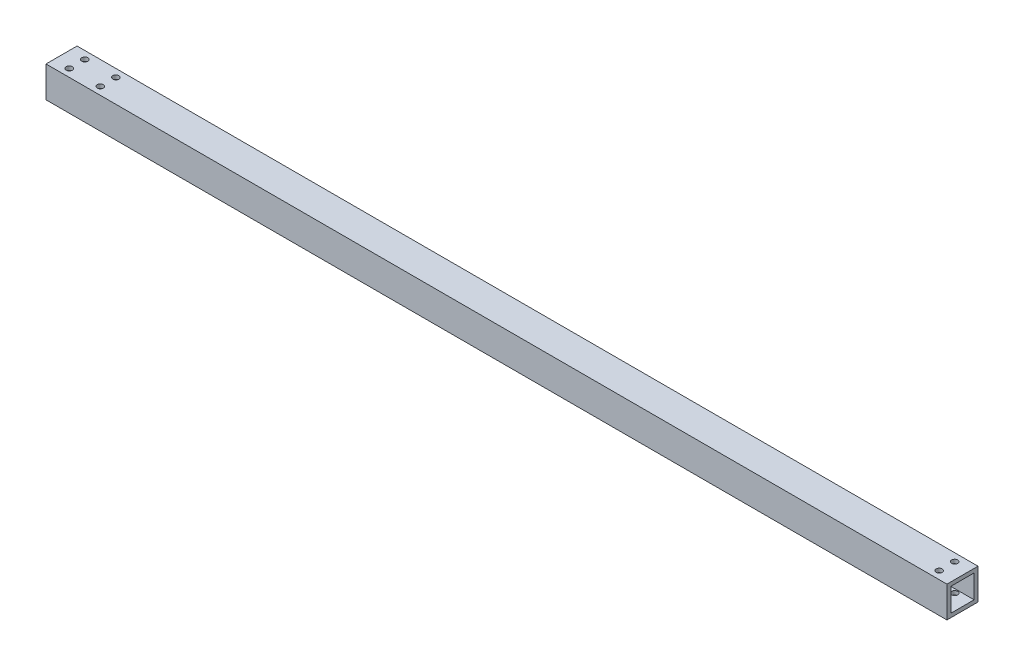
ISO-10303-21;
HEADER;
FILE_DESCRIPTION(('STEP AP214'),'2;1');
FILE_NAME('part.step','',(''),(''),'','','');
FILE_SCHEMA(('AUTOMOTIVE_DESIGN { 1 0 10303 214 1 1 1 1 }'));
ENDSEC;
DATA;
#1=APPLICATION_CONTEXT('core data for automotive mechanical design processes');
#2=APPLICATION_PROTOCOL_DEFINITION('international standard','automotive_design',2000,#1);
#3=PRODUCT_CONTEXT('',#1,'mechanical');
#4=PRODUCT('Part','Part','',(#3));
#5=PRODUCT_RELATED_PRODUCT_CATEGORY('part','',(#4));
#6=PRODUCT_DEFINITION_FORMATION('','',#4);
#7=PRODUCT_DEFINITION_CONTEXT('part definition',#1,'design');
#8=PRODUCT_DEFINITION('design','',#6,#7);
#9=PRODUCT_DEFINITION_SHAPE('','',#8);
#10=(LENGTH_UNIT() NAMED_UNIT(*) SI_UNIT(.MILLI.,.METRE.));
#11=(NAMED_UNIT(*) PLANE_ANGLE_UNIT() SI_UNIT($,.RADIAN.));
#12=(NAMED_UNIT(*) SI_UNIT($,.STERADIAN.) SOLID_ANGLE_UNIT());
#13=UNCERTAINTY_MEASURE_WITH_UNIT(LENGTH_MEASURE(1.E-05),#10,'distance_accuracy_value','');
#14=(GEOMETRIC_REPRESENTATION_CONTEXT(3) GLOBAL_UNCERTAINTY_ASSIGNED_CONTEXT((#13)) GLOBAL_UNIT_ASSIGNED_CONTEXT((#10,
#11,#12)) REPRESENTATION_CONTEXT('',''));
#15=CARTESIAN_POINT('',(0.,0.,0.));
#16=DIRECTION('',(0.,0.,1.));
#17=DIRECTION('',(1.,0.,0.));
#18=AXIS2_PLACEMENT_3D('',#15,#16,#17);
#19=CARTESIAN_POINT('',(812.8,0.,0.));
#20=DIRECTION('',(1.,0.,0.));
#21=DIRECTION('',(0.,0.,-1.));
#22=AXIS2_PLACEMENT_3D('',#19,#20,#21);
#23=PLANE('',#22);
#24=DIRECTION('',(0.,-1.,0.));
#25=VECTOR('',#24,1.);
#26=CARTESIAN_POINT('',(812.8,76.2,-88.9));
#27=LINE('',#26,#25);
#28=CARTESIAN_POINT('',(812.8,101.6,-88.9));
#29=VERTEX_POINT('',#28);
#30=CARTESIAN_POINT('',(812.8,76.2,-88.9));
#31=VERTEX_POINT('',#30);
#32=EDGE_CURVE('E176',#29,#31,#27,.T.);
#33=ORIENTED_EDGE('',*,*,#32,.T.);
#34=DIRECTION('',(0.,0.,-1.));
#35=VECTOR('',#34,1.);
#36=CARTESIAN_POINT('',(812.8,76.2,-88.9));
#37=LINE('',#36,#35);
#38=CARTESIAN_POINT('',(812.8,76.2,-114.3));
#39=VERTEX_POINT('',#38);
#40=EDGE_CURVE('E179',#31,#39,#37,.T.);
#41=ORIENTED_EDGE('',*,*,#40,.T.);
#42=DIRECTION('',(0.,1.,0.));
#43=VECTOR('',#42,1.);
#44=CARTESIAN_POINT('',(812.8,76.2,-114.3));
#45=LINE('',#44,#43);
#46=CARTESIAN_POINT('',(812.8,101.6,-114.3));
#47=VERTEX_POINT('',#46);
#48=EDGE_CURVE('E182',#39,#47,#45,.T.);
#49=ORIENTED_EDGE('',*,*,#48,.T.);
#50=DIRECTION('',(0.,0.,1.));
#51=VECTOR('',#50,1.);
#52=CARTESIAN_POINT('',(812.8,101.6,-88.9));
#53=LINE('',#52,#51);
#54=EDGE_CURVE('E184',#47,#29,#53,.T.);
#55=ORIENTED_EDGE('',*,*,#54,.T.);
#56=EDGE_LOOP('',(#33,#41,#49,#55));
#57=FACE_BOUND('',#56,.T.);
#58=DIRECTION('',(0.,0.,-1.));
#59=VECTOR('',#58,1.);
#60=CARTESIAN_POINT('',(812.8,79.375,0.));
#61=LINE('',#60,#59);
#62=CARTESIAN_POINT('',(812.8,79.375,-92.075));
#63=VERTEX_POINT('',#62);
#64=CARTESIAN_POINT('',(812.8,79.375,-111.125));
#65=VERTEX_POINT('',#64);
#66=EDGE_CURVE('E146',#63,#65,#61,.T.);
#67=ORIENTED_EDGE('',*,*,#66,.F.);
#68=DIRECTION('',(0.,-1.,0.));
#69=VECTOR('',#68,1.);
#70=CARTESIAN_POINT('',(812.8,0.,-92.075));
#71=LINE('',#70,#69);
#72=CARTESIAN_POINT('',(812.8,98.425,-92.075));
#73=VERTEX_POINT('',#72);
#74=EDGE_CURVE('E138',#73,#63,#71,.T.);
#75=ORIENTED_EDGE('',*,*,#74,.F.);
#76=DIRECTION('',(0.,0.,1.));
#77=VECTOR('',#76,1.);
#78=CARTESIAN_POINT('',(812.8,98.425,0.));
#79=LINE('',#78,#77);
#80=CARTESIAN_POINT('',(812.8,98.425,-111.125));
#81=VERTEX_POINT('',#80);
#82=EDGE_CURVE('E160',#81,#73,#79,.T.);
#83=ORIENTED_EDGE('',*,*,#82,.F.);
#84=DIRECTION('',(0.,1.,0.));
#85=VECTOR('',#84,1.);
#86=CARTESIAN_POINT('',(812.8,0.,-111.125));
#87=LINE('',#86,#85);
#88=EDGE_CURVE('E158',#65,#81,#87,.T.);
#89=ORIENTED_EDGE('',*,*,#88,.F.);
#90=EDGE_LOOP('',(#67,#75,#83,#89));
#91=FACE_BOUND('',#90,.T.);
#92=ADVANCED_FACE('F71',(#57,#91),#23,.T.);
#93=CARTESIAN_POINT('',(76.2,0.,0.));
#94=DIRECTION('',(1.,0.,0.));
#95=DIRECTION('',(0.,0.,-1.));
#96=AXIS2_PLACEMENT_3D('',#93,#94,#95);
#97=PLANE('',#96);
#98=DIRECTION('',(0.,-1.,0.));
#99=VECTOR('',#98,1.);
#100=CARTESIAN_POINT('',(76.2,76.2,-88.9));
#101=LINE('',#100,#99);
#102=CARTESIAN_POINT('',(76.2,101.6,-88.9));
#103=VERTEX_POINT('',#102);
#104=CARTESIAN_POINT('',(76.2,76.2,-88.9));
#105=VERTEX_POINT('',#104);
#106=EDGE_CURVE('E154',#103,#105,#101,.T.);
#107=ORIENTED_EDGE('',*,*,#106,.F.);
#108=DIRECTION('',(0.,0.,1.));
#109=VECTOR('',#108,1.);
#110=CARTESIAN_POINT('',(76.2,101.6,-88.9));
#111=LINE('',#110,#109);
#112=CARTESIAN_POINT('',(76.2,101.6,-114.3));
#113=VERTEX_POINT('',#112);
#114=EDGE_CURVE('E180',#113,#103,#111,.T.);
#115=ORIENTED_EDGE('',*,*,#114,.F.);
#116=DIRECTION('',(0.,1.,0.));
#117=VECTOR('',#116,1.);
#118=CARTESIAN_POINT('',(76.2,76.2,-114.3));
#119=LINE('',#118,#117);
#120=CARTESIAN_POINT('',(76.2,76.2,-114.3));
#121=VERTEX_POINT('',#120);
#122=EDGE_CURVE('E191',#121,#113,#119,.T.);
#123=ORIENTED_EDGE('',*,*,#122,.F.);
#124=DIRECTION('',(0.,0.,-1.));
#125=VECTOR('',#124,1.);
#126=CARTESIAN_POINT('',(76.2,76.2,-88.9));
#127=LINE('',#126,#125);
#128=EDGE_CURVE('E189',#105,#121,#127,.T.);
#129=ORIENTED_EDGE('',*,*,#128,.F.);
#130=EDGE_LOOP('',(#107,#115,#123,#129));
#131=FACE_BOUND('',#130,.T.);
#132=DIRECTION('',(0.,-1.,0.));
#133=VECTOR('',#132,1.);
#134=CARTESIAN_POINT('',(76.2,0.,-92.075));
#135=LINE('',#134,#133);
#136=CARTESIAN_POINT('',(76.2,98.425,-92.075));
#137=VERTEX_POINT('',#136);
#138=CARTESIAN_POINT('',(76.2,79.375,-92.075));
#139=VERTEX_POINT('',#138);
#140=EDGE_CURVE('E96',#137,#139,#135,.T.);
#141=ORIENTED_EDGE('',*,*,#140,.T.);
#142=DIRECTION('',(0.,0.,-1.));
#143=VECTOR('',#142,1.);
#144=CARTESIAN_POINT('',(76.2,79.375,0.));
#145=LINE('',#144,#143);
#146=CARTESIAN_POINT('',(76.2,79.375,-111.125));
#147=VERTEX_POINT('',#146);
#148=EDGE_CURVE('E153',#139,#147,#145,.T.);
#149=ORIENTED_EDGE('',*,*,#148,.T.);
#150=DIRECTION('',(0.,1.,0.));
#151=VECTOR('',#150,1.);
#152=CARTESIAN_POINT('',(76.2,0.,-111.125));
#153=LINE('',#152,#151);
#154=CARTESIAN_POINT('',(76.2,98.425,-111.125));
#155=VERTEX_POINT('',#154);
#156=EDGE_CURVE('E168',#147,#155,#153,.T.);
#157=ORIENTED_EDGE('',*,*,#156,.T.);
#158=DIRECTION('',(0.,0.,1.));
#159=VECTOR('',#158,1.);
#160=CARTESIAN_POINT('',(76.2,98.425,0.));
#161=LINE('',#160,#159);
#162=EDGE_CURVE('E147',#155,#137,#161,.T.);
#163=ORIENTED_EDGE('',*,*,#162,.T.);
#164=EDGE_LOOP('',(#141,#149,#157,#163));
#165=FACE_BOUND('',#164,.T.);
#166=ADVANCED_FACE('F272',(#131,#165),#97,.F.);
#167=CARTESIAN_POINT('',(812.8,76.2,-88.9));
#168=DIRECTION('',(0.,0.,-1.));
#169=DIRECTION('',(-1.,0.,0.));
#170=AXIS2_PLACEMENT_3D('',#167,#168,#169);
#171=PLANE('',#170);
#172=ORIENTED_EDGE('',*,*,#106,.T.);
#173=DIRECTION('',(-1.,0.,0.));
#174=VECTOR('',#173,1.);
#175=CARTESIAN_POINT('',(812.8,76.2,-88.9));
#176=LINE('',#175,#174);
#177=EDGE_CURVE('E12',#31,#105,#176,.T.);
#178=ORIENTED_EDGE('',*,*,#177,.F.);
#179=ORIENTED_EDGE('',*,*,#32,.F.);
#180=DIRECTION('',(-1.,0.,0.));
#181=VECTOR('',#180,1.);
#182=CARTESIAN_POINT('',(812.8,101.6,-88.9));
#183=LINE('',#182,#181);
#184=EDGE_CURVE('E186',#29,#103,#183,.T.);
#185=ORIENTED_EDGE('',*,*,#184,.T.);
#186=EDGE_LOOP('',(#172,#178,#179,#185));
#187=FACE_BOUND('',#186,.T.);
#188=ADVANCED_FACE('F73',(#187),#171,.F.);
#189=CARTESIAN_POINT('',(812.8,76.2,-88.9));
#190=DIRECTION('',(0.,1.,0.));
#191=DIRECTION('',(0.,0.,1.));
#192=AXIS2_PLACEMENT_3D('',#189,#190,#191);
#193=PLANE('',#192);
#194=CARTESIAN_POINT('',(88.9,76.2,-107.95));
#195=DIRECTION('',(0.,-1.,0.));
#196=DIRECTION('',(0.,0.,-1.));
#197=AXIS2_PLACEMENT_3D('',#194,#195,#196);
#198=CIRCLE('',#197,2.525);
#199=CARTESIAN_POINT('',(88.9,76.2,-110.475));
#200=VERTEX_POINT('',#199);
#201=EDGE_CURVE('E310',#200,#200,#198,.T.);
#202=ORIENTED_EDGE('',*,*,#201,.F.);
#203=EDGE_LOOP('',(#202));
#204=FACE_BOUND('',#203,.T.);
#205=CARTESIAN_POINT('',(88.9000000000002,76.2,-95.25));
#206=DIRECTION('',(0.,-1.,0.));
#207=DIRECTION('',(0.,0.,-1.));
#208=AXIS2_PLACEMENT_3D('',#205,#206,#207);
#209=CIRCLE('',#208,2.525);
#210=CARTESIAN_POINT('',(88.9000000000002,76.2,-97.775));
#211=VERTEX_POINT('',#210);
#212=EDGE_CURVE('E314',#211,#211,#209,.T.);
#213=ORIENTED_EDGE('',*,*,#212,.F.);
#214=EDGE_LOOP('',(#213));
#215=FACE_BOUND('',#214,.T.);
#216=CARTESIAN_POINT('',(114.3,76.2,-107.95));
#217=DIRECTION('',(0.,-1.,0.));
#218=DIRECTION('',(0.,0.,-1.));
#219=AXIS2_PLACEMENT_3D('',#216,#217,#218);
#220=CIRCLE('',#219,2.525);
#221=CARTESIAN_POINT('',(114.3,76.2,-110.475));
#222=VERTEX_POINT('',#221);
#223=EDGE_CURVE('E220',#222,#222,#220,.T.);
#224=ORIENTED_EDGE('',*,*,#223,.F.);
#225=EDGE_LOOP('',(#224));
#226=FACE_BOUND('',#225,.T.);
#227=CARTESIAN_POINT('',(114.3,76.2,-95.25));
#228=DIRECTION('',(0.,-1.,0.));
#229=DIRECTION('',(0.,0.,-1.));
#230=AXIS2_PLACEMENT_3D('',#227,#228,#229);
#231=CIRCLE('',#230,2.525);
#232=CARTESIAN_POINT('',(114.3,76.2,-97.775));
#233=VERTEX_POINT('',#232);
#234=EDGE_CURVE('E212',#233,#233,#231,.T.);
#235=ORIENTED_EDGE('',*,*,#234,.F.);
#236=EDGE_LOOP('',(#235));
#237=FACE_BOUND('',#236,.T.);
#238=CARTESIAN_POINT('',(800.1,76.2,-107.95));
#239=DIRECTION('',(0.,-1.,0.));
#240=DIRECTION('',(0.,0.,-1.));
#241=AXIS2_PLACEMENT_3D('',#238,#239,#240);
#242=CIRCLE('',#241,2.525);
#243=CARTESIAN_POINT('',(800.1,76.2,-110.475));
#244=VERTEX_POINT('',#243);
#245=EDGE_CURVE('E233',#244,#244,#242,.T.);
#246=ORIENTED_EDGE('',*,*,#245,.F.);
#247=EDGE_LOOP('',(#246));
#248=FACE_BOUND('',#247,.T.);
#249=CARTESIAN_POINT('',(800.1,76.2,-95.25));
#250=DIRECTION('',(0.,-1.,0.));
#251=DIRECTION('',(0.,0.,-1.));
#252=AXIS2_PLACEMENT_3D('',#249,#250,#251);
#253=CIRCLE('',#252,2.525);
#254=CARTESIAN_POINT('',(800.1,76.2,-97.775));
#255=VERTEX_POINT('',#254);
#256=EDGE_CURVE('E248',#255,#255,#253,.T.);
#257=ORIENTED_EDGE('',*,*,#256,.F.);
#258=EDGE_LOOP('',(#257));
#259=FACE_BOUND('',#258,.T.);
#260=ORIENTED_EDGE('',*,*,#128,.T.);
#261=DIRECTION('',(-1.,0.,0.));
#262=VECTOR('',#261,1.);
#263=CARTESIAN_POINT('',(812.8,76.2,-114.3));
#264=LINE('',#263,#262);
#265=EDGE_CURVE('E80',#39,#121,#264,.T.);
#266=ORIENTED_EDGE('',*,*,#265,.F.);
#267=ORIENTED_EDGE('',*,*,#40,.F.);
#268=ORIENTED_EDGE('',*,*,#177,.T.);
#269=EDGE_LOOP('',(#260,#266,#267,#268));
#270=FACE_BOUND('',#269,.T.);
#271=ADVANCED_FACE('F299',(#204,#215,#226,#237,#248,#259,#270),#193,.F.);
#272=CARTESIAN_POINT('',(812.8,76.2,-114.3));
#273=DIRECTION('',(0.,0.,1.));
#274=DIRECTION('',(1.,0.,0.));
#275=AXIS2_PLACEMENT_3D('',#272,#273,#274);
#276=PLANE('',#275);
#277=ORIENTED_EDGE('',*,*,#122,.T.);
#278=DIRECTION('',(-1.,0.,0.));
#279=VECTOR('',#278,1.);
#280=CARTESIAN_POINT('',(812.8,101.6,-114.3));
#281=LINE('',#280,#279);
#282=EDGE_CURVE('E196',#47,#113,#281,.T.);
#283=ORIENTED_EDGE('',*,*,#282,.F.);
#284=ORIENTED_EDGE('',*,*,#48,.F.);
#285=ORIENTED_EDGE('',*,*,#265,.T.);
#286=EDGE_LOOP('',(#277,#283,#284,#285));
#287=FACE_BOUND('',#286,.T.);
#288=ADVANCED_FACE('F296',(#287),#276,.F.);
#289=CARTESIAN_POINT('',(812.8,101.6,-88.9));
#290=DIRECTION('',(0.,-1.,0.));
#291=DIRECTION('',(0.,0.,-1.));
#292=AXIS2_PLACEMENT_3D('',#289,#290,#291);
#293=PLANE('',#292);
#294=CARTESIAN_POINT('',(88.9,101.6,-107.95));
#295=DIRECTION('',(0.,-1.,0.));
#296=DIRECTION('',(0.,0.,-1.));
#297=AXIS2_PLACEMENT_3D('',#294,#295,#296);
#298=CIRCLE('',#297,2.49999999999999);
#299=CARTESIAN_POINT('',(88.9,101.6,-110.45));
#300=VERTEX_POINT('',#299);
#301=EDGE_CURVE('E400',#300,#300,#298,.T.);
#302=ORIENTED_EDGE('',*,*,#301,.T.);
#303=EDGE_LOOP('',(#302));
#304=FACE_BOUND('',#303,.T.);
#305=CARTESIAN_POINT('',(88.9000000000002,101.6,-95.25));
#306=DIRECTION('',(0.,-1.,0.));
#307=DIRECTION('',(0.,0.,-1.));
#308=AXIS2_PLACEMENT_3D('',#305,#306,#307);
#309=CIRCLE('',#308,2.49999999999999);
#310=CARTESIAN_POINT('',(88.9000000000002,101.6,-97.75));
#311=VERTEX_POINT('',#310);
#312=EDGE_CURVE('E415',#311,#311,#309,.T.);
#313=ORIENTED_EDGE('',*,*,#312,.T.);
#314=EDGE_LOOP('',(#313));
#315=FACE_BOUND('',#314,.T.);
#316=CARTESIAN_POINT('',(114.3,101.6,-107.95));
#317=DIRECTION('',(0.,-1.,0.));
#318=DIRECTION('',(0.,0.,-1.));
#319=AXIS2_PLACEMENT_3D('',#316,#317,#318);
#320=CIRCLE('',#319,2.49999999999999);
#321=CARTESIAN_POINT('',(114.3,101.6,-110.45));
#322=VERTEX_POINT('',#321);
#323=EDGE_CURVE('E208',#322,#322,#320,.T.);
#324=ORIENTED_EDGE('',*,*,#323,.T.);
#325=EDGE_LOOP('',(#324));
#326=FACE_BOUND('',#325,.T.);
#327=CARTESIAN_POINT('',(114.3,101.6,-95.25));
#328=DIRECTION('',(0.,-1.,0.));
#329=DIRECTION('',(0.,0.,-1.));
#330=AXIS2_PLACEMENT_3D('',#327,#328,#329);
#331=CIRCLE('',#330,2.49999999999999);
#332=CARTESIAN_POINT('',(114.3,101.6,-97.75));
#333=VERTEX_POINT('',#332);
#334=EDGE_CURVE('E204',#333,#333,#331,.T.);
#335=ORIENTED_EDGE('',*,*,#334,.T.);
#336=EDGE_LOOP('',(#335));
#337=FACE_BOUND('',#336,.T.);
#338=CARTESIAN_POINT('',(800.1,101.6,-107.95));
#339=DIRECTION('',(0.,-1.,0.));
#340=DIRECTION('',(0.,0.,-1.));
#341=AXIS2_PLACEMENT_3D('',#338,#339,#340);
#342=CIRCLE('',#341,2.49999999999995);
#343=CARTESIAN_POINT('',(800.1,101.6,-110.45));
#344=VERTEX_POINT('',#343);
#345=EDGE_CURVE('E239',#344,#344,#342,.T.);
#346=ORIENTED_EDGE('',*,*,#345,.T.);
#347=EDGE_LOOP('',(#346));
#348=FACE_BOUND('',#347,.T.);
#349=CARTESIAN_POINT('',(800.1,101.6,-95.25));
#350=DIRECTION('',(0.,-1.,0.));
#351=DIRECTION('',(0.,0.,-1.));
#352=AXIS2_PLACEMENT_3D('',#349,#350,#351);
#353=CIRCLE('',#352,2.49999999999995);
#354=CARTESIAN_POINT('',(800.1,101.6,-97.7499999999999));
#355=VERTEX_POINT('',#354);
#356=EDGE_CURVE('E254',#355,#355,#353,.T.);
#357=ORIENTED_EDGE('',*,*,#356,.T.);
#358=EDGE_LOOP('',(#357));
#359=FACE_BOUND('',#358,.T.);
#360=ORIENTED_EDGE('',*,*,#114,.T.);
#361=ORIENTED_EDGE('',*,*,#184,.F.);
#362=ORIENTED_EDGE('',*,*,#54,.F.);
#363=ORIENTED_EDGE('',*,*,#282,.T.);
#364=EDGE_LOOP('',(#360,#361,#362,#363));
#365=FACE_BOUND('',#364,.T.);
#366=ADVANCED_FACE('F293',(#304,#315,#326,#337,#348,#359,#365),#293,.F.);
#367=CARTESIAN_POINT('',(812.8,0.,-92.075));
#368=DIRECTION('',(0.,0.,-1.));
#369=DIRECTION('',(-1.,0.,0.));
#370=AXIS2_PLACEMENT_3D('',#367,#368,#369);
#371=PLANE('',#370);
#372=ORIENTED_EDGE('',*,*,#140,.F.);
#373=DIRECTION('',(-1.,0.,0.));
#374=VECTOR('',#373,1.);
#375=CARTESIAN_POINT('',(812.8,98.425,-92.075));
#376=LINE('',#375,#374);
#377=EDGE_CURVE('E142',#73,#137,#376,.T.);
#378=ORIENTED_EDGE('',*,*,#377,.F.);
#379=ORIENTED_EDGE('',*,*,#74,.T.);
#380=DIRECTION('',(-1.,0.,0.));
#381=VECTOR('',#380,1.);
#382=CARTESIAN_POINT('',(812.8,79.375,-92.075));
#383=LINE('',#382,#381);
#384=EDGE_CURVE('E141',#63,#139,#383,.T.);
#385=ORIENTED_EDGE('',*,*,#384,.T.);
#386=EDGE_LOOP('',(#372,#378,#379,#385));
#387=FACE_BOUND('',#386,.T.);
#388=ADVANCED_FACE('F140',(#387),#371,.T.);
#389=CARTESIAN_POINT('',(812.8,79.375,0.));
#390=DIRECTION('',(0.,1.,0.));
#391=DIRECTION('',(0.,0.,1.));
#392=AXIS2_PLACEMENT_3D('',#389,#390,#391);
#393=PLANE('',#392);
#394=CARTESIAN_POINT('',(88.9,79.375,-107.95));
#395=DIRECTION('',(0.,1.,0.));
#396=DIRECTION('',(0.,0.,1.));
#397=AXIS2_PLACEMENT_3D('',#394,#395,#396);
#398=CIRCLE('',#397,2.49999999999999);
#399=CARTESIAN_POINT('',(88.9,79.375,-105.45));
#400=VERTEX_POINT('',#399);
#401=EDGE_CURVE('E408',#400,#400,#398,.T.);
#402=ORIENTED_EDGE('',*,*,#401,.F.);
#403=EDGE_LOOP('',(#402));
#404=FACE_BOUND('',#403,.T.);
#405=CARTESIAN_POINT('',(88.9000000000002,79.375,-95.25));
#406=DIRECTION('',(0.,1.,0.));
#407=DIRECTION('',(0.,0.,1.));
#408=AXIS2_PLACEMENT_3D('',#405,#406,#407);
#409=CIRCLE('',#408,2.49999999999999);
#410=CARTESIAN_POINT('',(88.9000000000002,79.375,-92.75));
#411=VERTEX_POINT('',#410);
#412=EDGE_CURVE('E418',#411,#411,#409,.T.);
#413=ORIENTED_EDGE('',*,*,#412,.F.);
#414=EDGE_LOOP('',(#413));
#415=FACE_BOUND('',#414,.T.);
#416=CARTESIAN_POINT('',(114.3,79.375,-107.95));
#417=DIRECTION('',(0.,1.,0.));
#418=DIRECTION('',(0.,0.,1.));
#419=AXIS2_PLACEMENT_3D('',#416,#417,#418);
#420=CIRCLE('',#419,2.49999999999999);
#421=CARTESIAN_POINT('',(114.3,79.375,-105.45));
#422=VERTEX_POINT('',#421);
#423=EDGE_CURVE('E205',#422,#422,#420,.T.);
#424=ORIENTED_EDGE('',*,*,#423,.F.);
#425=EDGE_LOOP('',(#424));
#426=FACE_BOUND('',#425,.T.);
#427=CARTESIAN_POINT('',(114.3,79.375,-95.25));
#428=DIRECTION('',(0.,1.,0.));
#429=DIRECTION('',(0.,0.,1.));
#430=AXIS2_PLACEMENT_3D('',#427,#428,#429);
#431=CIRCLE('',#430,2.49999999999999);
#432=CARTESIAN_POINT('',(114.3,79.375,-92.75));
#433=VERTEX_POINT('',#432);
#434=EDGE_CURVE('E203',#433,#433,#431,.T.);
#435=ORIENTED_EDGE('',*,*,#434,.F.);
#436=EDGE_LOOP('',(#435));
#437=FACE_BOUND('',#436,.T.);
#438=CARTESIAN_POINT('',(800.1,79.375,-107.95));
#439=DIRECTION('',(0.,1.,0.));
#440=DIRECTION('',(0.,0.,1.));
#441=AXIS2_PLACEMENT_3D('',#438,#439,#440);
#442=CIRCLE('',#441,2.49999999999995);
#443=CARTESIAN_POINT('',(800.1,79.375,-105.45));
#444=VERTEX_POINT('',#443);
#445=EDGE_CURVE('E245',#444,#444,#442,.T.);
#446=ORIENTED_EDGE('',*,*,#445,.F.);
#447=EDGE_LOOP('',(#446));
#448=FACE_BOUND('',#447,.T.);
#449=CARTESIAN_POINT('',(800.1,79.375,-95.25));
#450=DIRECTION('',(0.,1.,0.));
#451=DIRECTION('',(0.,0.,1.));
#452=AXIS2_PLACEMENT_3D('',#449,#450,#451);
#453=CIRCLE('',#452,2.49999999999995);
#454=CARTESIAN_POINT('',(800.1,79.375,-92.7500000000001));
#455=VERTEX_POINT('',#454);
#456=EDGE_CURVE('E257',#455,#455,#453,.T.);
#457=ORIENTED_EDGE('',*,*,#456,.F.);
#458=EDGE_LOOP('',(#457));
#459=FACE_BOUND('',#458,.T.);
#460=ORIENTED_EDGE('',*,*,#148,.F.);
#461=ORIENTED_EDGE('',*,*,#384,.F.);
#462=ORIENTED_EDGE('',*,*,#66,.T.);
#463=DIRECTION('',(-1.,0.,0.));
#464=VECTOR('',#463,1.);
#465=CARTESIAN_POINT('',(812.8,79.375,-111.125));
#466=LINE('',#465,#464);
#467=EDGE_CURVE('E155',#65,#147,#466,.T.);
#468=ORIENTED_EDGE('',*,*,#467,.T.);
#469=EDGE_LOOP('',(#460,#461,#462,#468));
#470=FACE_BOUND('',#469,.T.);
#471=ADVANCED_FACE('F150',(#404,#415,#426,#437,#448,#459,#470),#393,.T.);
#472=CARTESIAN_POINT('',(812.8,0.,-111.125));
#473=DIRECTION('',(0.,0.,1.));
#474=DIRECTION('',(1.,0.,0.));
#475=AXIS2_PLACEMENT_3D('',#472,#473,#474);
#476=PLANE('',#475);
#477=ORIENTED_EDGE('',*,*,#156,.F.);
#478=ORIENTED_EDGE('',*,*,#467,.F.);
#479=ORIENTED_EDGE('',*,*,#88,.T.);
#480=DIRECTION('',(-1.,0.,0.));
#481=VECTOR('',#480,1.);
#482=CARTESIAN_POINT('',(812.8,98.425,-111.125));
#483=LINE('',#482,#481);
#484=EDGE_CURVE('E88',#81,#155,#483,.T.);
#485=ORIENTED_EDGE('',*,*,#484,.T.);
#486=EDGE_LOOP('',(#477,#478,#479,#485));
#487=FACE_BOUND('',#486,.T.);
#488=ADVANCED_FACE('F267',(#487),#476,.T.);
#489=CARTESIAN_POINT('',(812.8,98.425,0.));
#490=DIRECTION('',(0.,-1.,0.));
#491=DIRECTION('',(0.,0.,-1.));
#492=AXIS2_PLACEMENT_3D('',#489,#490,#491);
#493=PLANE('',#492);
#494=CARTESIAN_POINT('',(88.9,98.425,-107.95));
#495=DIRECTION('',(0.,-1.,0.));
#496=DIRECTION('',(0.,0.,-1.));
#497=AXIS2_PLACEMENT_3D('',#494,#495,#496);
#498=CIRCLE('',#497,2.49999999999999);
#499=CARTESIAN_POINT('',(88.9,98.425,-110.45));
#500=VERTEX_POINT('',#499);
#501=EDGE_CURVE('E405',#500,#500,#498,.T.);
#502=ORIENTED_EDGE('',*,*,#501,.F.);
#503=EDGE_LOOP('',(#502));
#504=FACE_BOUND('',#503,.T.);
#505=CARTESIAN_POINT('',(88.9000000000002,98.425,-95.25));
#506=DIRECTION('',(0.,-1.,0.));
#507=DIRECTION('',(0.,0.,-1.));
#508=AXIS2_PLACEMENT_3D('',#505,#506,#507);
#509=CIRCLE('',#508,2.49999999999999);
#510=CARTESIAN_POINT('',(88.9000000000002,98.425,-97.75));
#511=VERTEX_POINT('',#510);
#512=EDGE_CURVE('E75',#511,#511,#509,.T.);
#513=ORIENTED_EDGE('',*,*,#512,.F.);
#514=EDGE_LOOP('',(#513));
#515=FACE_BOUND('',#514,.T.);
#516=CARTESIAN_POINT('',(114.3,98.425,-107.95));
#517=DIRECTION('',(0.,-1.,0.));
#518=DIRECTION('',(0.,0.,-1.));
#519=AXIS2_PLACEMENT_3D('',#516,#517,#518);
#520=CIRCLE('',#519,2.49999999999999);
#521=CARTESIAN_POINT('',(114.3,98.425,-110.45));
#522=VERTEX_POINT('',#521);
#523=EDGE_CURVE('E207',#522,#522,#520,.T.);
#524=ORIENTED_EDGE('',*,*,#523,.F.);
#525=EDGE_LOOP('',(#524));
#526=FACE_BOUND('',#525,.T.);
#527=CARTESIAN_POINT('',(114.3,98.425,-95.25));
#528=DIRECTION('',(0.,-1.,0.));
#529=DIRECTION('',(0.,0.,-1.));
#530=AXIS2_PLACEMENT_3D('',#527,#528,#529);
#531=CIRCLE('',#530,2.49999999999999);
#532=CARTESIAN_POINT('',(114.3,98.425,-97.75));
#533=VERTEX_POINT('',#532);
#534=EDGE_CURVE('E201',#533,#533,#531,.T.);
#535=ORIENTED_EDGE('',*,*,#534,.F.);
#536=EDGE_LOOP('',(#535));
#537=FACE_BOUND('',#536,.T.);
#538=CARTESIAN_POINT('',(800.1,98.425,-107.95));
#539=DIRECTION('',(0.,-1.,0.));
#540=DIRECTION('',(0.,0.,-1.));
#541=AXIS2_PLACEMENT_3D('',#538,#539,#540);
#542=CIRCLE('',#541,2.49999999999995);
#543=CARTESIAN_POINT('',(800.1,98.425,-110.45));
#544=VERTEX_POINT('',#543);
#545=EDGE_CURVE('E242',#544,#544,#542,.T.);
#546=ORIENTED_EDGE('',*,*,#545,.F.);
#547=EDGE_LOOP('',(#546));
#548=FACE_BOUND('',#547,.T.);
#549=CARTESIAN_POINT('',(800.1,98.425,-95.25));
#550=DIRECTION('',(0.,-1.,0.));
#551=DIRECTION('',(0.,0.,-1.));
#552=AXIS2_PLACEMENT_3D('',#549,#550,#551);
#553=CIRCLE('',#552,2.49999999999995);
#554=CARTESIAN_POINT('',(800.1,98.425,-97.7499999999999));
#555=VERTEX_POINT('',#554);
#556=EDGE_CURVE('E166',#555,#555,#553,.T.);
#557=ORIENTED_EDGE('',*,*,#556,.F.);
#558=EDGE_LOOP('',(#557));
#559=FACE_BOUND('',#558,.T.);
#560=ORIENTED_EDGE('',*,*,#162,.F.);
#561=ORIENTED_EDGE('',*,*,#484,.F.);
#562=ORIENTED_EDGE('',*,*,#82,.T.);
#563=ORIENTED_EDGE('',*,*,#377,.T.);
#564=EDGE_LOOP('',(#560,#561,#562,#563));
#565=FACE_BOUND('',#564,.T.);
#566=ADVANCED_FACE('F265',(#504,#515,#526,#537,#548,#559,#565),#493,.T.);
#567=CARTESIAN_POINT('',(800.1,76.2,-95.25));
#568=DIRECTION('',(0.,-1.,0.));
#569=DIRECTION('',(0.,0.,-1.));
#570=AXIS2_PLACEMENT_3D('',#567,#568,#569);
#571=CYLINDRICAL_SURFACE('',#570,2.49999999999995);
#572=ORIENTED_EDGE('',*,*,#556,.T.);
#573=EDGE_LOOP('',(#572));
#574=FACE_BOUND('',#573,.T.);
#575=ORIENTED_EDGE('',*,*,#356,.F.);
#576=EDGE_LOOP('',(#575));
#577=FACE_BOUND('',#576,.T.);
#578=ADVANCED_FACE('F262',(#574,#577),#571,.F.);
#579=ORIENTED_EDGE('',*,*,#456,.T.);
#580=EDGE_LOOP('',(#579));
#581=FACE_BOUND('',#580,.T.);
#582=CARTESIAN_POINT('',(800.1,76.225,-95.25));
#583=DIRECTION('',(0.,-1.,0.));
#584=DIRECTION('',(0.,0.,-1.));
#585=AXIS2_PLACEMENT_3D('',#582,#583,#584);
#586=CIRCLE('',#585,2.49999999999995);
#587=CARTESIAN_POINT('',(800.1,76.225,-97.7499999999999));
#588=VERTEX_POINT('',#587);
#589=EDGE_CURVE('E251',#588,#588,#586,.T.);
#590=ORIENTED_EDGE('',*,*,#589,.T.);
#591=EDGE_LOOP('',(#590));
#592=FACE_BOUND('',#591,.T.);
#593=ADVANCED_FACE('F339',(#581,#592),#571,.F.);
#594=CARTESIAN_POINT('',(800.1,76.2,-95.25));
#595=DIRECTION('',(0.,-1.,0.));
#596=DIRECTION('',(0.,0.,-1.));
#597=AXIS2_PLACEMENT_3D('',#594,#595,#596);
#598=CONICAL_SURFACE('',#597,2.525,0.785398163398003);
#599=ORIENTED_EDGE('',*,*,#589,.F.);
#600=EDGE_LOOP('',(#599));
#601=FACE_BOUND('',#600,.T.);
#602=ORIENTED_EDGE('',*,*,#256,.T.);
#603=EDGE_LOOP('',(#602));
#604=FACE_BOUND('',#603,.T.);
#605=ADVANCED_FACE('F336',(#601,#604),#598,.F.);
#606=CARTESIAN_POINT('',(800.1,76.2,-107.95));
#607=DIRECTION('',(0.,-1.,0.));
#608=DIRECTION('',(0.,0.,-1.));
#609=AXIS2_PLACEMENT_3D('',#606,#607,#608);
#610=CYLINDRICAL_SURFACE('',#609,2.49999999999995);
#611=ORIENTED_EDGE('',*,*,#545,.T.);
#612=EDGE_LOOP('',(#611));
#613=FACE_BOUND('',#612,.T.);
#614=ORIENTED_EDGE('',*,*,#345,.F.);
#615=EDGE_LOOP('',(#614));
#616=FACE_BOUND('',#615,.T.);
#617=ADVANCED_FACE('F338',(#613,#616),#610,.F.);
#618=ORIENTED_EDGE('',*,*,#445,.T.);
#619=EDGE_LOOP('',(#618));
#620=FACE_BOUND('',#619,.T.);
#621=CARTESIAN_POINT('',(800.1,76.225,-107.95));
#622=DIRECTION('',(0.,-1.,0.));
#623=DIRECTION('',(0.,0.,-1.));
#624=AXIS2_PLACEMENT_3D('',#621,#622,#623);
#625=CIRCLE('',#624,2.49999999999995);
#626=CARTESIAN_POINT('',(800.1,76.225,-110.45));
#627=VERTEX_POINT('',#626);
#628=EDGE_CURVE('E236',#627,#627,#625,.T.);
#629=ORIENTED_EDGE('',*,*,#628,.T.);
#630=EDGE_LOOP('',(#629));
#631=FACE_BOUND('',#630,.T.);
#632=ADVANCED_FACE('F346',(#620,#631),#610,.F.);
#633=CARTESIAN_POINT('',(800.1,76.2,-107.95));
#634=DIRECTION('',(0.,-1.,0.));
#635=DIRECTION('',(0.,0.,-1.));
#636=AXIS2_PLACEMENT_3D('',#633,#634,#635);
#637=CONICAL_SURFACE('',#636,2.525,0.785398163398003);
#638=ORIENTED_EDGE('',*,*,#628,.F.);
#639=EDGE_LOOP('',(#638));
#640=FACE_BOUND('',#639,.T.);
#641=ORIENTED_EDGE('',*,*,#245,.T.);
#642=EDGE_LOOP('',(#641));
#643=FACE_BOUND('',#642,.T.);
#644=ADVANCED_FACE('F353',(#640,#643),#637,.F.);
#645=CARTESIAN_POINT('',(114.3,76.2,-95.25));
#646=DIRECTION('',(0.,-1.,0.));
#647=DIRECTION('',(0.,0.,-1.));
#648=AXIS2_PLACEMENT_3D('',#645,#646,#647);
#649=CYLINDRICAL_SURFACE('',#648,2.49999999999999);
#650=ORIENTED_EDGE('',*,*,#534,.T.);
#651=EDGE_LOOP('',(#650));
#652=FACE_BOUND('',#651,.T.);
#653=ORIENTED_EDGE('',*,*,#334,.F.);
#654=EDGE_LOOP('',(#653));
#655=FACE_BOUND('',#654,.T.);
#656=ADVANCED_FACE('F356',(#652,#655),#649,.F.);
#657=ORIENTED_EDGE('',*,*,#434,.T.);
#658=EDGE_LOOP('',(#657));
#659=FACE_BOUND('',#658,.T.);
#660=CARTESIAN_POINT('',(114.3,76.225,-95.25));
#661=DIRECTION('',(0.,-1.,0.));
#662=DIRECTION('',(0.,0.,-1.));
#663=AXIS2_PLACEMENT_3D('',#660,#661,#662);
#664=CIRCLE('',#663,2.49999999999999);
#665=CARTESIAN_POINT('',(114.3,76.225,-97.75));
#666=VERTEX_POINT('',#665);
#667=EDGE_CURVE('E226',#666,#666,#664,.T.);
#668=ORIENTED_EDGE('',*,*,#667,.T.);
#669=EDGE_LOOP('',(#668));
#670=FACE_BOUND('',#669,.T.);
#671=ADVANCED_FACE('F360',(#659,#670),#649,.F.);
#672=CARTESIAN_POINT('',(114.3,76.2,-95.25));
#673=DIRECTION('',(0.,-1.,0.));
#674=DIRECTION('',(0.,0.,-1.));
#675=AXIS2_PLACEMENT_3D('',#672,#673,#674);
#676=CONICAL_SURFACE('',#675,2.525,0.785398163397171);
#677=ORIENTED_EDGE('',*,*,#667,.F.);
#678=EDGE_LOOP('',(#677));
#679=FACE_BOUND('',#678,.T.);
#680=ORIENTED_EDGE('',*,*,#234,.T.);
#681=EDGE_LOOP('',(#680));
#682=FACE_BOUND('',#681,.T.);
#683=ADVANCED_FACE('F362',(#679,#682),#676,.F.);
#684=CARTESIAN_POINT('',(114.3,76.2,-107.95));
#685=DIRECTION('',(0.,-1.,0.));
#686=DIRECTION('',(0.,0.,-1.));
#687=AXIS2_PLACEMENT_3D('',#684,#685,#686);
#688=CYLINDRICAL_SURFACE('',#687,2.49999999999999);
#689=ORIENTED_EDGE('',*,*,#423,.T.);
#690=EDGE_LOOP('',(#689));
#691=FACE_BOUND('',#690,.T.);
#692=CARTESIAN_POINT('',(114.3,76.225,-107.95));
#693=DIRECTION('',(0.,-1.,0.));
#694=DIRECTION('',(0.,0.,-1.));
#695=AXIS2_PLACEMENT_3D('',#692,#693,#694);
#696=CIRCLE('',#695,2.49999999999999);
#697=CARTESIAN_POINT('',(114.3,76.225,-110.45));
#698=VERTEX_POINT('',#697);
#699=EDGE_CURVE('E215',#698,#698,#696,.T.);
#700=ORIENTED_EDGE('',*,*,#699,.T.);
#701=EDGE_LOOP('',(#700));
#702=FACE_BOUND('',#701,.T.);
#703=ADVANCED_FACE('F365',(#691,#702),#688,.F.);
#704=CARTESIAN_POINT('',(114.3,76.2,-107.95));
#705=DIRECTION('',(0.,-1.,0.));
#706=DIRECTION('',(0.,0.,-1.));
#707=AXIS2_PLACEMENT_3D('',#704,#705,#706);
#708=CONICAL_SURFACE('',#707,2.525,0.785398163397171);
#709=ORIENTED_EDGE('',*,*,#699,.F.);
#710=EDGE_LOOP('',(#709));
#711=FACE_BOUND('',#710,.T.);
#712=ORIENTED_EDGE('',*,*,#223,.T.);
#713=EDGE_LOOP('',(#712));
#714=FACE_BOUND('',#713,.T.);
#715=ADVANCED_FACE('F369',(#711,#714),#708,.F.);
#716=ORIENTED_EDGE('',*,*,#523,.T.);
#717=EDGE_LOOP('',(#716));
#718=FACE_BOUND('',#717,.T.);
#719=ORIENTED_EDGE('',*,*,#323,.F.);
#720=EDGE_LOOP('',(#719));
#721=FACE_BOUND('',#720,.T.);
#722=ADVANCED_FACE('F370',(#718,#721),#688,.F.);
#723=CARTESIAN_POINT('',(88.9000000000002,76.2,-95.25));
#724=DIRECTION('',(0.,-1.,0.));
#725=DIRECTION('',(0.,0.,-1.));
#726=AXIS2_PLACEMENT_3D('',#723,#724,#725);
#727=CYLINDRICAL_SURFACE('',#726,2.49999999999999);
#728=ORIENTED_EDGE('',*,*,#512,.T.);
#729=EDGE_LOOP('',(#728));
#730=FACE_BOUND('',#729,.T.);
#731=ORIENTED_EDGE('',*,*,#312,.F.);
#732=EDGE_LOOP('',(#731));
#733=FACE_BOUND('',#732,.T.);
#734=ADVANCED_FACE('F374',(#730,#733),#727,.F.);
#735=ORIENTED_EDGE('',*,*,#412,.T.);
#736=EDGE_LOOP('',(#735));
#737=FACE_BOUND('',#736,.T.);
#738=CARTESIAN_POINT('',(88.9000000000002,76.225,-95.25));
#739=DIRECTION('',(0.,-1.,0.));
#740=DIRECTION('',(0.,0.,-1.));
#741=AXIS2_PLACEMENT_3D('',#738,#739,#740);
#742=CIRCLE('',#741,2.49999999999999);
#743=CARTESIAN_POINT('',(88.9000000000002,76.225,-97.75));
#744=VERTEX_POINT('',#743);
#745=EDGE_CURVE('E412',#744,#744,#742,.T.);
#746=ORIENTED_EDGE('',*,*,#745,.T.);
#747=EDGE_LOOP('',(#746));
#748=FACE_BOUND('',#747,.T.);
#749=ADVANCED_FACE('F377',(#737,#748),#727,.F.);
#750=CARTESIAN_POINT('',(88.9000000000002,76.2,-95.25));
#751=DIRECTION('',(0.,-1.,0.));
#752=DIRECTION('',(0.,0.,-1.));
#753=AXIS2_PLACEMENT_3D('',#750,#751,#752);
#754=CONICAL_SURFACE('',#753,2.525,0.785398163397171);
#755=ORIENTED_EDGE('',*,*,#745,.F.);
#756=EDGE_LOOP('',(#755));
#757=FACE_BOUND('',#756,.T.);
#758=ORIENTED_EDGE('',*,*,#212,.T.);
#759=EDGE_LOOP('',(#758));
#760=FACE_BOUND('',#759,.T.);
#761=ADVANCED_FACE('F379',(#757,#760),#754,.F.);
#762=CARTESIAN_POINT('',(88.9,76.2,-107.95));
#763=DIRECTION('',(0.,-1.,0.));
#764=DIRECTION('',(0.,0.,-1.));
#765=AXIS2_PLACEMENT_3D('',#762,#763,#764);
#766=CYLINDRICAL_SURFACE('',#765,2.49999999999999);
#767=ORIENTED_EDGE('',*,*,#501,.T.);
#768=EDGE_LOOP('',(#767));
#769=FACE_BOUND('',#768,.T.);
#770=ORIENTED_EDGE('',*,*,#301,.F.);
#771=EDGE_LOOP('',(#770));
#772=FACE_BOUND('',#771,.T.);
#773=ADVANCED_FACE('F382',(#769,#772),#766,.F.);
#774=ORIENTED_EDGE('',*,*,#401,.T.);
#775=EDGE_LOOP('',(#774));
#776=FACE_BOUND('',#775,.T.);
#777=CARTESIAN_POINT('',(88.9,76.225,-107.95));
#778=DIRECTION('',(0.,-1.,0.));
#779=DIRECTION('',(0.,0.,-1.));
#780=AXIS2_PLACEMENT_3D('',#777,#778,#779);
#781=CIRCLE('',#780,2.49999999999999);
#782=CARTESIAN_POINT('',(88.9,76.225,-110.45));
#783=VERTEX_POINT('',#782);
#784=EDGE_CURVE('E398',#783,#783,#781,.T.);
#785=ORIENTED_EDGE('',*,*,#784,.T.);
#786=EDGE_LOOP('',(#785));
#787=FACE_BOUND('',#786,.T.);
#788=ADVANCED_FACE('F386',(#776,#787),#766,.F.);
#789=CARTESIAN_POINT('',(88.9,76.2,-107.95));
#790=DIRECTION('',(0.,-1.,0.));
#791=DIRECTION('',(0.,0.,-1.));
#792=AXIS2_PLACEMENT_3D('',#789,#790,#791);
#793=CONICAL_SURFACE('',#792,2.525,0.785398163397171);
#794=ORIENTED_EDGE('',*,*,#784,.F.);
#795=EDGE_LOOP('',(#794));
#796=FACE_BOUND('',#795,.T.);
#797=ORIENTED_EDGE('',*,*,#201,.T.);
#798=EDGE_LOOP('',(#797));
#799=FACE_BOUND('',#798,.T.);
#800=ADVANCED_FACE('F388',(#796,#799),#793,.F.);
#801=CLOSED_SHELL('',(#92,#166,#188,#271,#288,#366,#388,#471,#488,#566,#578,#593,#605,#617,#632,
#644,#656,#671,#683,#703,#715,#722,#734,#749,#761,#773,#788,#800));
#802=MANIFOLD_SOLID_BREP('B2',#801);
#803=ADVANCED_BREP_SHAPE_REPRESENTATION('',(#18,#802),#14);
#804=SHAPE_DEFINITION_REPRESENTATION(#9,#803);
ENDSEC;
END-ISO-10303-21;
